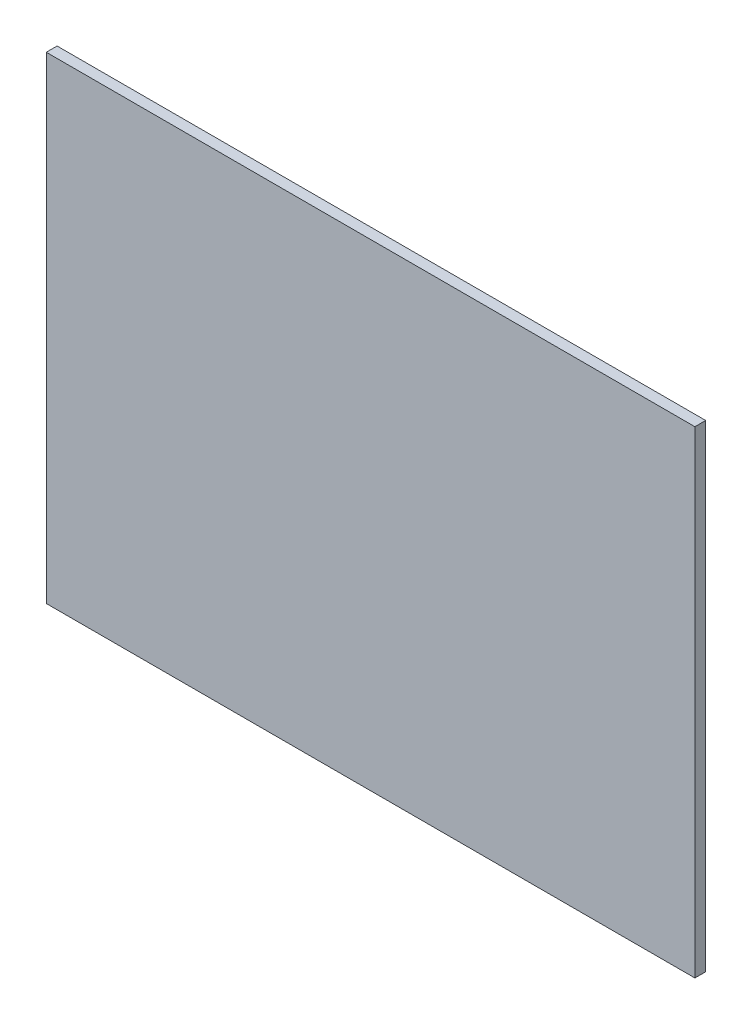
ISO-10303-21;
HEADER;
FILE_DESCRIPTION(('STEP AP214'),'2;1');
FILE_NAME('part.step','',(''),(''),'','','');
FILE_SCHEMA(('AUTOMOTIVE_DESIGN { 1 0 10303 214 1 1 1 1 }'));
ENDSEC;
DATA;
#1=APPLICATION_CONTEXT('core data for automotive mechanical design processes');
#2=APPLICATION_PROTOCOL_DEFINITION('international standard','automotive_design',2000,#1);
#3=PRODUCT_CONTEXT('',#1,'mechanical');
#4=PRODUCT('Part','Part','',(#3));
#5=PRODUCT_RELATED_PRODUCT_CATEGORY('part','',(#4));
#6=PRODUCT_DEFINITION_FORMATION('','',#4);
#7=PRODUCT_DEFINITION_CONTEXT('part definition',#1,'design');
#8=PRODUCT_DEFINITION('design','',#6,#7);
#9=PRODUCT_DEFINITION_SHAPE('','',#8);
#10=(LENGTH_UNIT() NAMED_UNIT(*) SI_UNIT(.MILLI.,.METRE.));
#11=(NAMED_UNIT(*) PLANE_ANGLE_UNIT() SI_UNIT($,.RADIAN.));
#12=(NAMED_UNIT(*) SI_UNIT($,.STERADIAN.) SOLID_ANGLE_UNIT());
#13=UNCERTAINTY_MEASURE_WITH_UNIT(LENGTH_MEASURE(1.E-05),#10,'distance_accuracy_value','');
#14=(GEOMETRIC_REPRESENTATION_CONTEXT(3) GLOBAL_UNCERTAINTY_ASSIGNED_CONTEXT((#13)) GLOBAL_UNIT_ASSIGNED_CONTEXT((#10,
#11,#12)) REPRESENTATION_CONTEXT('',''));
#15=CARTESIAN_POINT('',(0.,0.,0.));
#16=DIRECTION('',(0.,0.,1.));
#17=DIRECTION('',(1.,0.,0.));
#18=AXIS2_PLACEMENT_3D('',#15,#16,#17);
#19=CARTESIAN_POINT('',(90.,-66.25,3.));
#20=DIRECTION('',(-1.,0.,0.));
#21=DIRECTION('',(0.,0.,1.));
#22=AXIS2_PLACEMENT_3D('',#19,#20,#21);
#23=PLANE('',#22);
#24=DIRECTION('',(0.,1.,0.));
#25=VECTOR('',#24,1.);
#26=CARTESIAN_POINT('',(90.,-66.25,0.));
#27=LINE('',#26,#25);
#28=CARTESIAN_POINT('',(90.,-66.25,0.));
#29=VERTEX_POINT('',#28);
#30=CARTESIAN_POINT('',(90.,66.25,0.));
#31=VERTEX_POINT('',#30);
#32=EDGE_CURVE('E98',#29,#31,#27,.T.);
#33=ORIENTED_EDGE('',*,*,#32,.T.);
#34=DIRECTION('',(0.,0.,-1.));
#35=VECTOR('',#34,1.);
#36=CARTESIAN_POINT('',(90.,66.25,3.));
#37=LINE('',#36,#35);
#38=CARTESIAN_POINT('',(90.,66.25,3.));
#39=VERTEX_POINT('',#38);
#40=EDGE_CURVE('E11',#39,#31,#37,.T.);
#41=ORIENTED_EDGE('',*,*,#40,.F.);
#42=DIRECTION('',(0.,1.,0.));
#43=VECTOR('',#42,1.);
#44=CARTESIAN_POINT('',(90.,-66.25,3.));
#45=LINE('',#44,#43);
#46=CARTESIAN_POINT('',(90.,-66.25,3.));
#47=VERTEX_POINT('',#46);
#48=EDGE_CURVE('E86',#47,#39,#45,.T.);
#49=ORIENTED_EDGE('',*,*,#48,.F.);
#50=DIRECTION('',(0.,0.,-1.));
#51=VECTOR('',#50,1.);
#52=CARTESIAN_POINT('',(90.,-66.25,3.));
#53=LINE('',#52,#51);
#54=EDGE_CURVE('E94',#47,#29,#53,.T.);
#55=ORIENTED_EDGE('',*,*,#54,.T.);
#56=EDGE_LOOP('',(#33,#41,#49,#55));
#57=FACE_BOUND('',#56,.T.);
#58=ADVANCED_FACE('F35',(#57),#23,.F.);
#59=CARTESIAN_POINT('',(-90.,66.25,3.));
#60=DIRECTION('',(0.,-1.,0.));
#61=DIRECTION('',(0.,0.,-1.));
#62=AXIS2_PLACEMENT_3D('',#59,#60,#61);
#63=PLANE('',#62);
#64=DIRECTION('',(-1.,0.,0.));
#65=VECTOR('',#64,1.);
#66=CARTESIAN_POINT('',(-90.,66.25,0.));
#67=LINE('',#66,#65);
#68=CARTESIAN_POINT('',(-90.,66.25,0.));
#69=VERTEX_POINT('',#68);
#70=EDGE_CURVE('E90',#31,#69,#67,.T.);
#71=ORIENTED_EDGE('',*,*,#70,.T.);
#72=DIRECTION('',(0.,0.,-1.));
#73=VECTOR('',#72,1.);
#74=CARTESIAN_POINT('',(-90.,66.25,3.));
#75=LINE('',#74,#73);
#76=CARTESIAN_POINT('',(-90.,66.25,3.));
#77=VERTEX_POINT('',#76);
#78=EDGE_CURVE('E43',#77,#69,#75,.T.);
#79=ORIENTED_EDGE('',*,*,#78,.F.);
#80=DIRECTION('',(-1.,0.,0.));
#81=VECTOR('',#80,1.);
#82=CARTESIAN_POINT('',(-90.,66.25,3.));
#83=LINE('',#82,#81);
#84=EDGE_CURVE('E81',#39,#77,#83,.T.);
#85=ORIENTED_EDGE('',*,*,#84,.F.);
#86=ORIENTED_EDGE('',*,*,#40,.T.);
#87=EDGE_LOOP('',(#71,#79,#85,#86));
#88=FACE_BOUND('',#87,.T.);
#89=ADVANCED_FACE('F89',(#88),#63,.F.);
#90=CARTESIAN_POINT('',(-90.,-66.25,3.));
#91=DIRECTION('',(1.,0.,0.));
#92=DIRECTION('',(0.,0.,-1.));
#93=AXIS2_PLACEMENT_3D('',#90,#91,#92);
#94=PLANE('',#93);
#95=DIRECTION('',(0.,-1.,0.));
#96=VECTOR('',#95,1.);
#97=CARTESIAN_POINT('',(-90.,-66.25,0.));
#98=LINE('',#97,#96);
#99=CARTESIAN_POINT('',(-90.,-66.25,0.));
#100=VERTEX_POINT('',#99);
#101=EDGE_CURVE('E68',#69,#100,#98,.T.);
#102=ORIENTED_EDGE('',*,*,#101,.T.);
#103=DIRECTION('',(0.,0.,-1.));
#104=VECTOR('',#103,1.);
#105=CARTESIAN_POINT('',(-90.,-66.25,3.));
#106=LINE('',#105,#104);
#107=CARTESIAN_POINT('',(-90.,-66.25,3.));
#108=VERTEX_POINT('',#107);
#109=EDGE_CURVE('E91',#108,#100,#106,.T.);
#110=ORIENTED_EDGE('',*,*,#109,.F.);
#111=DIRECTION('',(0.,-1.,0.));
#112=VECTOR('',#111,1.);
#113=CARTESIAN_POINT('',(-90.,-66.25,3.));
#114=LINE('',#113,#112);
#115=EDGE_CURVE('E84',#77,#108,#114,.T.);
#116=ORIENTED_EDGE('',*,*,#115,.F.);
#117=ORIENTED_EDGE('',*,*,#78,.T.);
#118=EDGE_LOOP('',(#102,#110,#116,#117));
#119=FACE_BOUND('',#118,.T.);
#120=ADVANCED_FACE('F92',(#119),#94,.F.);
#121=CARTESIAN_POINT('',(-90.,-66.25,3.));
#122=DIRECTION('',(0.,1.,0.));
#123=DIRECTION('',(0.,0.,1.));
#124=AXIS2_PLACEMENT_3D('',#121,#122,#123);
#125=PLANE('',#124);
#126=DIRECTION('',(1.,0.,0.));
#127=VECTOR('',#126,1.);
#128=CARTESIAN_POINT('',(-90.,-66.25,0.));
#129=LINE('',#128,#127);
#130=EDGE_CURVE('E74',#100,#29,#129,.T.);
#131=ORIENTED_EDGE('',*,*,#130,.T.);
#132=ORIENTED_EDGE('',*,*,#54,.F.);
#133=DIRECTION('',(1.,0.,0.));
#134=VECTOR('',#133,1.);
#135=CARTESIAN_POINT('',(-90.,-66.25,3.));
#136=LINE('',#135,#134);
#137=EDGE_CURVE('E51',#108,#47,#136,.T.);
#138=ORIENTED_EDGE('',*,*,#137,.F.);
#139=ORIENTED_EDGE('',*,*,#109,.T.);
#140=EDGE_LOOP('',(#131,#132,#138,#139));
#141=FACE_BOUND('',#140,.T.);
#142=ADVANCED_FACE('F105',(#141),#125,.F.);
#143=CARTESIAN_POINT('',(0.,0.,3.));
#144=DIRECTION('',(0.,0.,-1.));
#145=DIRECTION('',(-1.,0.,0.));
#146=AXIS2_PLACEMENT_3D('',#143,#144,#145);
#147=PLANE('',#146);
#148=ORIENTED_EDGE('',*,*,#48,.T.);
#149=ORIENTED_EDGE('',*,*,#84,.T.);
#150=ORIENTED_EDGE('',*,*,#115,.T.);
#151=ORIENTED_EDGE('',*,*,#137,.T.);
#152=EDGE_LOOP('',(#148,#149,#150,#151));
#153=FACE_BOUND('',#152,.T.);
#154=ADVANCED_FACE('F82',(#153),#147,.F.);
#155=CARTESIAN_POINT('',(0.,0.,0.));
#156=DIRECTION('',(0.,0.,-1.));
#157=DIRECTION('',(-1.,0.,0.));
#158=AXIS2_PLACEMENT_3D('',#155,#156,#157);
#159=PLANE('',#158);
#160=ORIENTED_EDGE('',*,*,#32,.F.);
#161=ORIENTED_EDGE('',*,*,#130,.F.);
#162=ORIENTED_EDGE('',*,*,#101,.F.);
#163=ORIENTED_EDGE('',*,*,#70,.F.);
#164=EDGE_LOOP('',(#160,#161,#162,#163));
#165=FACE_BOUND('',#164,.T.);
#166=ADVANCED_FACE('F108',(#165),#159,.T.);
#167=CLOSED_SHELL('',(#58,#89,#120,#142,#154,#166));
#168=MANIFOLD_SOLID_BREP('B2',#167);
#169=ADVANCED_BREP_SHAPE_REPRESENTATION('',(#18,#168),#14);
#170=SHAPE_DEFINITION_REPRESENTATION(#9,#169);
ENDSEC;
END-ISO-10303-21;
